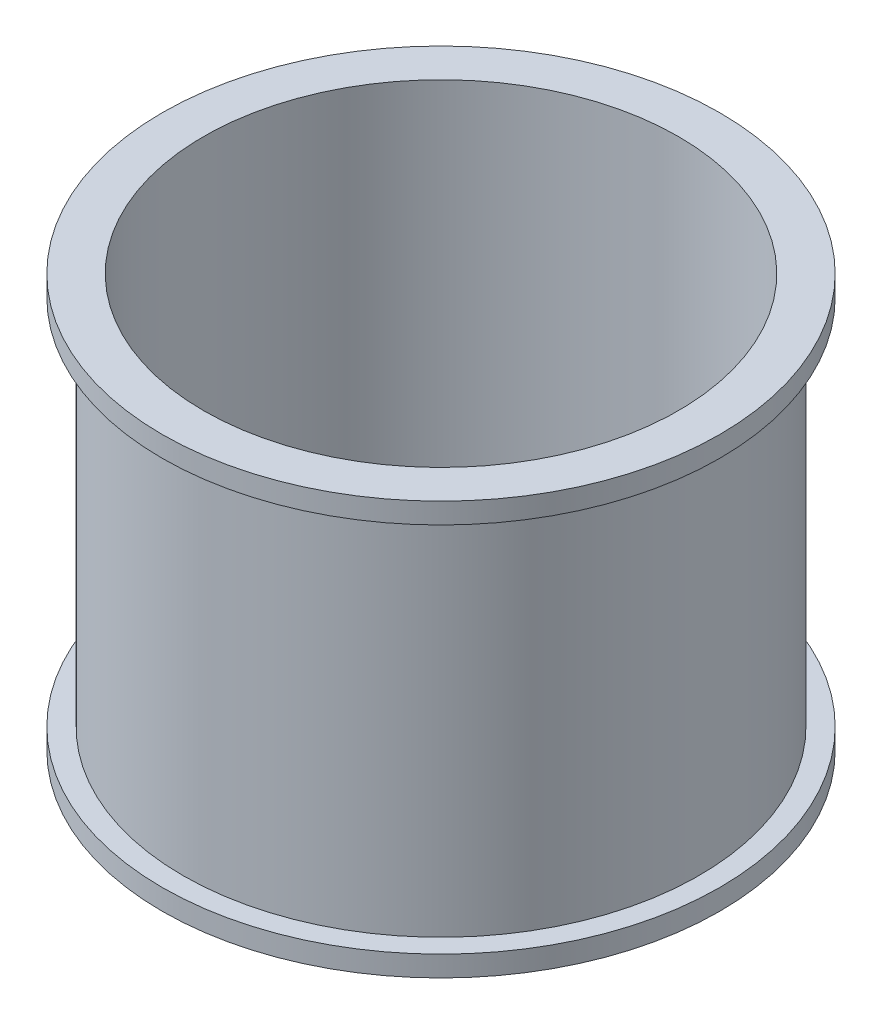
ISO-10303-21;
HEADER;
FILE_DESCRIPTION(('STEP AP214'),'2;1');
FILE_NAME('part.step','',(''),(''),'','','');
FILE_SCHEMA(('AUTOMOTIVE_DESIGN { 1 0 10303 214 1 1 1 1 }'));
ENDSEC;
DATA;
#1=APPLICATION_CONTEXT('core data for automotive mechanical design processes');
#2=APPLICATION_PROTOCOL_DEFINITION('international standard','automotive_design',2000,#1);
#3=PRODUCT_CONTEXT('',#1,'mechanical');
#4=PRODUCT('Part','Part','',(#3));
#5=PRODUCT_RELATED_PRODUCT_CATEGORY('part','',(#4));
#6=PRODUCT_DEFINITION_FORMATION('','',#4);
#7=PRODUCT_DEFINITION_CONTEXT('part definition',#1,'design');
#8=PRODUCT_DEFINITION('design','',#6,#7);
#9=PRODUCT_DEFINITION_SHAPE('','',#8);
#10=(LENGTH_UNIT() NAMED_UNIT(*) SI_UNIT(.MILLI.,.METRE.));
#11=(NAMED_UNIT(*) PLANE_ANGLE_UNIT() SI_UNIT($,.RADIAN.));
#12=(NAMED_UNIT(*) SI_UNIT($,.STERADIAN.) SOLID_ANGLE_UNIT());
#13=UNCERTAINTY_MEASURE_WITH_UNIT(LENGTH_MEASURE(1.E-05),#10,'distance_accuracy_value','');
#14=(GEOMETRIC_REPRESENTATION_CONTEXT(3) GLOBAL_UNCERTAINTY_ASSIGNED_CONTEXT((#13)) GLOBAL_UNIT_ASSIGNED_CONTEXT((#10,
#11,#12)) REPRESENTATION_CONTEXT('',''));
#15=CARTESIAN_POINT('',(0.,0.,0.));
#16=DIRECTION('',(0.,0.,1.));
#17=DIRECTION('',(1.,0.,0.));
#18=AXIS2_PLACEMENT_3D('',#15,#16,#17);
#19=CARTESIAN_POINT('',(0.,5.,0.));
#20=DIRECTION('',(0.,-1.,0.));
#21=DIRECTION('',(0.,0.,-1.));
#22=AXIS2_PLACEMENT_3D('',#19,#20,#21);
#23=CYLINDRICAL_SURFACE('',#22,5.75);
#24=CARTESIAN_POINT('',(0.,0.,0.));
#25=DIRECTION('',(0.,1.,0.));
#26=DIRECTION('',(0.,0.,1.));
#27=AXIS2_PLACEMENT_3D('',#24,#25,#26);
#28=CIRCLE('',#27,5.75);
#29=CARTESIAN_POINT('',(0.,0.,5.75));
#30=VERTEX_POINT('',#29);
#31=EDGE_CURVE('E10',#30,#30,#28,.T.);
#32=ORIENTED_EDGE('',*,*,#31,.F.);
#33=EDGE_LOOP('',(#32));
#34=FACE_BOUND('',#33,.T.);
#35=CARTESIAN_POINT('',(0.,10.,0.));
#36=DIRECTION('',(0.,1.,0.));
#37=DIRECTION('',(0.,0.,1.));
#38=AXIS2_PLACEMENT_3D('',#35,#36,#37);
#39=CIRCLE('',#38,5.75);
#40=CARTESIAN_POINT('',(0.,10.,5.75));
#41=VERTEX_POINT('',#40);
#42=EDGE_CURVE('E66',#41,#41,#39,.T.);
#43=ORIENTED_EDGE('',*,*,#42,.T.);
#44=EDGE_LOOP('',(#43));
#45=FACE_BOUND('',#44,.T.);
#46=ADVANCED_FACE('F43',(#34,#45),#23,.F.);
#47=CARTESIAN_POINT('',(0.,5.,0.));
#48=DIRECTION('',(0.,-1.,0.));
#49=DIRECTION('',(0.,0.,-1.));
#50=AXIS2_PLACEMENT_3D('',#47,#48,#49);
#51=CYLINDRICAL_SURFACE('',#50,6.25);
#52=CARTESIAN_POINT('',(0.,9.5,0.));
#53=DIRECTION('',(0.,1.,0.));
#54=DIRECTION('',(0.,0.,1.));
#55=AXIS2_PLACEMENT_3D('',#52,#53,#54);
#56=CIRCLE('',#55,6.25);
#57=CARTESIAN_POINT('',(0.,9.5,6.25));
#58=VERTEX_POINT('',#57);
#59=EDGE_CURVE('E76',#58,#58,#56,.T.);
#60=ORIENTED_EDGE('',*,*,#59,.F.);
#61=EDGE_LOOP('',(#60));
#62=FACE_BOUND('',#61,.T.);
#63=CARTESIAN_POINT('',(0.,0.5,0.));
#64=DIRECTION('',(0.,1.,0.));
#65=DIRECTION('',(0.,0.,1.));
#66=AXIS2_PLACEMENT_3D('',#63,#64,#65);
#67=CIRCLE('',#66,6.25);
#68=CARTESIAN_POINT('',(0.,0.5,6.25));
#69=VERTEX_POINT('',#68);
#70=EDGE_CURVE('E55',#69,#69,#67,.T.);
#71=ORIENTED_EDGE('',*,*,#70,.T.);
#72=EDGE_LOOP('',(#71));
#73=FACE_BOUND('',#72,.T.);
#74=ADVANCED_FACE('F90',(#62,#73),#51,.T.);
#75=CARTESIAN_POINT('',(0.,0.,0.));
#76=DIRECTION('',(0.,1.,0.));
#77=DIRECTION('',(0.,0.,1.));
#78=AXIS2_PLACEMENT_3D('',#75,#76,#77);
#79=PLANE('',#78);
#80=ORIENTED_EDGE('',*,*,#31,.T.);
#81=EDGE_LOOP('',(#80));
#82=FACE_BOUND('',#81,.T.);
#83=CARTESIAN_POINT('',(0.,0.,0.));
#84=DIRECTION('',(0.,1.,0.));
#85=DIRECTION('',(0.,0.,1.));
#86=AXIS2_PLACEMENT_3D('',#83,#84,#85);
#87=CIRCLE('',#86,6.75);
#88=CARTESIAN_POINT('',(0.,0.,6.75));
#89=VERTEX_POINT('',#88);
#90=EDGE_CURVE('E61',#89,#89,#87,.T.);
#91=ORIENTED_EDGE('',*,*,#90,.F.);
#92=EDGE_LOOP('',(#91));
#93=FACE_BOUND('',#92,.T.);
#94=ADVANCED_FACE('F93',(#82,#93),#79,.F.);
#95=CARTESIAN_POINT('',(0.,0.5,0.));
#96=DIRECTION('',(0.,-1.,0.));
#97=DIRECTION('',(0.,0.,-1.));
#98=AXIS2_PLACEMENT_3D('',#95,#96,#97);
#99=CYLINDRICAL_SURFACE('',#98,6.75);
#100=CARTESIAN_POINT('',(0.,0.5,0.));
#101=DIRECTION('',(0.,1.,0.));
#102=DIRECTION('',(0.,0.,1.));
#103=AXIS2_PLACEMENT_3D('',#100,#101,#102);
#104=CIRCLE('',#103,6.75);
#105=CARTESIAN_POINT('',(0.,0.5,6.75));
#106=VERTEX_POINT('',#105);
#107=EDGE_CURVE('E50',#106,#106,#104,.T.);
#108=ORIENTED_EDGE('',*,*,#107,.F.);
#109=EDGE_LOOP('',(#108));
#110=FACE_BOUND('',#109,.T.);
#111=ORIENTED_EDGE('',*,*,#90,.T.);
#112=EDGE_LOOP('',(#111));
#113=FACE_BOUND('',#112,.T.);
#114=ADVANCED_FACE('F99',(#110,#113),#99,.T.);
#115=CARTESIAN_POINT('',(0.,0.5,0.));
#116=DIRECTION('',(0.,1.,0.));
#117=DIRECTION('',(0.,0.,1.));
#118=AXIS2_PLACEMENT_3D('',#115,#116,#117);
#119=PLANE('',#118);
#120=ORIENTED_EDGE('',*,*,#70,.F.);
#121=EDGE_LOOP('',(#120));
#122=FACE_BOUND('',#121,.T.);
#123=ORIENTED_EDGE('',*,*,#107,.T.);
#124=EDGE_LOOP('',(#123));
#125=FACE_BOUND('',#124,.T.);
#126=ADVANCED_FACE('F96',(#122,#125),#119,.T.);
#127=CARTESIAN_POINT('',(0.,10.,0.));
#128=DIRECTION('',(0.,-1.,0.));
#129=DIRECTION('',(0.,0.,1.));
#130=AXIS2_PLACEMENT_3D('',#127,#128,#129);
#131=PLANE('',#130);
#132=ORIENTED_EDGE('',*,*,#42,.F.);
#133=EDGE_LOOP('',(#132));
#134=FACE_BOUND('',#133,.T.);
#135=CARTESIAN_POINT('',(0.,10.,0.));
#136=DIRECTION('',(0.,1.,0.));
#137=DIRECTION('',(0.,0.,1.));
#138=AXIS2_PLACEMENT_3D('',#135,#136,#137);
#139=CIRCLE('',#138,6.75);
#140=CARTESIAN_POINT('',(0.,10.,6.75));
#141=VERTEX_POINT('',#140);
#142=EDGE_CURVE('E79',#141,#141,#139,.T.);
#143=ORIENTED_EDGE('',*,*,#142,.T.);
#144=EDGE_LOOP('',(#143));
#145=FACE_BOUND('',#144,.T.);
#146=ADVANCED_FACE('F98',(#134,#145),#131,.F.);
#147=CARTESIAN_POINT('',(0.,9.5,0.));
#148=DIRECTION('',(0.,1.,0.));
#149=DIRECTION('',(0.,0.,1.));
#150=AXIS2_PLACEMENT_3D('',#147,#148,#149);
#151=CYLINDRICAL_SURFACE('',#150,6.75);
#152=CARTESIAN_POINT('',(0.,9.5,0.));
#153=DIRECTION('',(0.,1.,0.));
#154=DIRECTION('',(0.,0.,1.));
#155=AXIS2_PLACEMENT_3D('',#152,#153,#154);
#156=CIRCLE('',#155,6.75);
#157=CARTESIAN_POINT('',(0.,9.5,6.75));
#158=VERTEX_POINT('',#157);
#159=EDGE_CURVE('E71',#158,#158,#156,.T.);
#160=ORIENTED_EDGE('',*,*,#159,.T.);
#161=EDGE_LOOP('',(#160));
#162=FACE_BOUND('',#161,.T.);
#163=ORIENTED_EDGE('',*,*,#142,.F.);
#164=EDGE_LOOP('',(#163));
#165=FACE_BOUND('',#164,.T.);
#166=ADVANCED_FACE('F106',(#162,#165),#151,.T.);
#167=CARTESIAN_POINT('',(0.,9.5,0.));
#168=DIRECTION('',(0.,-1.,0.));
#169=DIRECTION('',(0.,0.,1.));
#170=AXIS2_PLACEMENT_3D('',#167,#168,#169);
#171=PLANE('',#170);
#172=ORIENTED_EDGE('',*,*,#59,.T.);
#173=EDGE_LOOP('',(#172));
#174=FACE_BOUND('',#173,.T.);
#175=ORIENTED_EDGE('',*,*,#159,.F.);
#176=EDGE_LOOP('',(#175));
#177=FACE_BOUND('',#176,.T.);
#178=ADVANCED_FACE('F87',(#174,#177),#171,.T.);
#179=CLOSED_SHELL('',(#46,#74,#94,#114,#126,#146,#166,#178));
#180=MANIFOLD_SOLID_BREP('B2',#179);
#181=ADVANCED_BREP_SHAPE_REPRESENTATION('',(#18,#180),#14);
#182=SHAPE_DEFINITION_REPRESENTATION(#9,#181);
ENDSEC;
END-ISO-10303-21;
